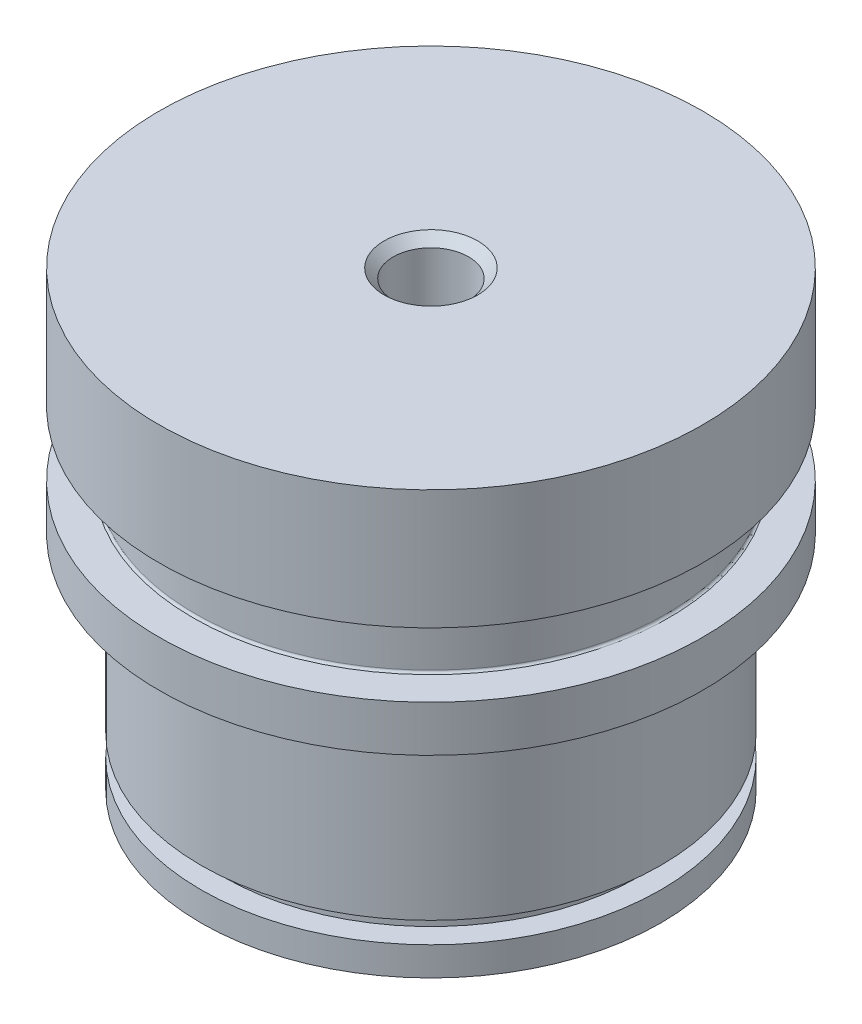
ISO-10303-21;
HEADER;
FILE_DESCRIPTION(('STEP AP214'),'2;1');
FILE_NAME('part.step','',(''),(''),'','','');
FILE_SCHEMA(('AUTOMOTIVE_DESIGN { 1 0 10303 214 1 1 1 1 }'));
ENDSEC;
DATA;
#1=APPLICATION_CONTEXT('core data for automotive mechanical design processes');
#2=APPLICATION_PROTOCOL_DEFINITION('international standard','automotive_design',2000,#1);
#3=PRODUCT_CONTEXT('',#1,'mechanical');
#4=PRODUCT('Part','Part','',(#3));
#5=PRODUCT_RELATED_PRODUCT_CATEGORY('part','',(#4));
#6=PRODUCT_DEFINITION_FORMATION('','',#4);
#7=PRODUCT_DEFINITION_CONTEXT('part definition',#1,'design');
#8=PRODUCT_DEFINITION('design','',#6,#7);
#9=PRODUCT_DEFINITION_SHAPE('','',#8);
#10=(LENGTH_UNIT() NAMED_UNIT(*) SI_UNIT(.MILLI.,.METRE.));
#11=(NAMED_UNIT(*) PLANE_ANGLE_UNIT() SI_UNIT($,.RADIAN.));
#12=(NAMED_UNIT(*) SI_UNIT($,.STERADIAN.) SOLID_ANGLE_UNIT());
#13=UNCERTAINTY_MEASURE_WITH_UNIT(LENGTH_MEASURE(1.E-05),#10,'distance_accuracy_value','');
#14=(GEOMETRIC_REPRESENTATION_CONTEXT(3) GLOBAL_UNCERTAINTY_ASSIGNED_CONTEXT((#13)) GLOBAL_UNIT_ASSIGNED_CONTEXT((#10,
#11,#12)) REPRESENTATION_CONTEXT('',''));
#15=CARTESIAN_POINT('',(0.,0.,0.));
#16=DIRECTION('',(0.,0.,1.));
#17=DIRECTION('',(1.,0.,0.));
#18=AXIS2_PLACEMENT_3D('',#15,#16,#17);
#19=CARTESIAN_POINT('',(-10.16,0.,0.));
#20=DIRECTION('',(0.,1.,0.));
#21=DIRECTION('',(0.,0.,1.));
#22=AXIS2_PLACEMENT_3D('',#19,#20,#21);
#23=PLANE('',#22);
#24=CARTESIAN_POINT('',(0.,0.,0.));
#25=DIRECTION('',(0.,1.,0.));
#26=DIRECTION('',(0.,0.,1.));
#27=AXIS2_PLACEMENT_3D('',#24,#25,#26);
#28=CIRCLE('',#27,10.6336634939895);
#29=CARTESIAN_POINT('',(0.,0.,10.6336634939895));
#30=VERTEX_POINT('',#29);
#31=EDGE_CURVE('E57',#30,#30,#28,.T.);
#32=ORIENTED_EDGE('',*,*,#31,.T.);
#33=EDGE_LOOP('',(#32));
#34=FACE_BOUND('',#33,.T.);
#35=CARTESIAN_POINT('',(0.,0.,0.));
#36=DIRECTION('',(0.,-1.,0.));
#37=DIRECTION('',(0.,0.,-1.));
#38=AXIS2_PLACEMENT_3D('',#35,#36,#37);
#39=CIRCLE('',#38,12.7);
#40=CARTESIAN_POINT('',(0.,0.,-12.7));
#41=VERTEX_POINT('',#40);
#42=EDGE_CURVE('E78',#41,#41,#39,.T.);
#43=ORIENTED_EDGE('',*,*,#42,.T.);
#44=EDGE_LOOP('',(#43));
#45=FACE_BOUND('',#44,.T.);
#46=ADVANCED_FACE('F36',(#34,#45),#23,.F.);
#47=CARTESIAN_POINT('',(0.,0.,0.));
#48=DIRECTION('',(0.,-1.,0.));
#49=DIRECTION('',(0.,0.,-1.));
#50=AXIS2_PLACEMENT_3D('',#47,#48,#49);
#51=CYLINDRICAL_SURFACE('',#50,12.7);
#52=ORIENTED_EDGE('',*,*,#42,.F.);
#53=EDGE_LOOP('',(#52));
#54=FACE_BOUND('',#53,.T.);
#55=CARTESIAN_POINT('',(0.,1.5875,0.));
#56=DIRECTION('',(0.,-1.,0.));
#57=DIRECTION('',(0.,0.,-1.));
#58=AXIS2_PLACEMENT_3D('',#55,#56,#57);
#59=CIRCLE('',#58,12.7);
#60=CARTESIAN_POINT('',(0.,1.5875,-12.7));
#61=VERTEX_POINT('',#60);
#62=EDGE_CURVE('E81',#61,#61,#59,.T.);
#63=ORIENTED_EDGE('',*,*,#62,.T.);
#64=EDGE_LOOP('',(#63));
#65=FACE_BOUND('',#64,.T.);
#66=ADVANCED_FACE('F191',(#54,#65),#51,.T.);
#67=CARTESIAN_POINT('',(-12.7,1.5875,0.));
#68=DIRECTION('',(0.,-1.,0.));
#69=DIRECTION('',(0.,0.,-1.));
#70=AXIS2_PLACEMENT_3D('',#67,#68,#69);
#71=PLANE('',#70);
#72=ORIENTED_EDGE('',*,*,#62,.F.);
#73=EDGE_LOOP('',(#72));
#74=FACE_BOUND('',#73,.T.);
#75=CARTESIAN_POINT('',(0.,1.5875,0.));
#76=DIRECTION('',(0.,-1.,0.));
#77=DIRECTION('',(0.,0.,-1.));
#78=AXIS2_PLACEMENT_3D('',#75,#76,#77);
#79=CIRCLE('',#78,11.4681);
#80=CARTESIAN_POINT('',(0.,1.5875,-11.4681));
#81=VERTEX_POINT('',#80);
#82=EDGE_CURVE('E84',#81,#81,#79,.T.);
#83=ORIENTED_EDGE('',*,*,#82,.T.);
#84=EDGE_LOOP('',(#83));
#85=FACE_BOUND('',#84,.T.);
#86=ADVANCED_FACE('F197',(#74,#85),#71,.F.);
#87=CARTESIAN_POINT('',(0.,0.,0.));
#88=DIRECTION('',(0.,-1.,0.));
#89=DIRECTION('',(0.,0.,-1.));
#90=AXIS2_PLACEMENT_3D('',#87,#88,#89);
#91=CYLINDRICAL_SURFACE('',#90,11.4681);
#92=ORIENTED_EDGE('',*,*,#82,.F.);
#93=EDGE_LOOP('',(#92));
#94=FACE_BOUND('',#93,.T.);
#95=CARTESIAN_POINT('',(0.,2.7559,0.));
#96=DIRECTION('',(0.,-1.,0.));
#97=DIRECTION('',(0.,0.,-1.));
#98=AXIS2_PLACEMENT_3D('',#95,#96,#97);
#99=CIRCLE('',#98,11.4681);
#100=CARTESIAN_POINT('',(0.,2.7559,-11.4681));
#101=VERTEX_POINT('',#100);
#102=EDGE_CURVE('E87',#101,#101,#99,.T.);
#103=ORIENTED_EDGE('',*,*,#102,.T.);
#104=EDGE_LOOP('',(#103));
#105=FACE_BOUND('',#104,.T.);
#106=ADVANCED_FACE('F276',(#94,#105),#91,.T.);
#107=CARTESIAN_POINT('',(-11.4681,2.7559,0.));
#108=DIRECTION('',(0.,1.,0.));
#109=DIRECTION('',(0.,0.,1.));
#110=AXIS2_PLACEMENT_3D('',#107,#108,#109);
#111=PLANE('',#110);
#112=ORIENTED_EDGE('',*,*,#102,.F.);
#113=EDGE_LOOP('',(#112));
#114=FACE_BOUND('',#113,.T.);
#115=CARTESIAN_POINT('',(0.,2.7559,0.));
#116=DIRECTION('',(0.,-1.,0.));
#117=DIRECTION('',(0.,0.,-1.));
#118=AXIS2_PLACEMENT_3D('',#115,#116,#117);
#119=CIRCLE('',#118,12.7);
#120=CARTESIAN_POINT('',(0.,2.7559,-12.7));
#121=VERTEX_POINT('',#120);
#122=EDGE_CURVE('E90',#121,#121,#119,.T.);
#123=ORIENTED_EDGE('',*,*,#122,.T.);
#124=EDGE_LOOP('',(#123));
#125=FACE_BOUND('',#124,.T.);
#126=ADVANCED_FACE('F272',(#114,#125),#111,.F.);
#127=CARTESIAN_POINT('',(0.,0.,0.));
#128=DIRECTION('',(0.,-1.,0.));
#129=DIRECTION('',(0.,0.,-1.));
#130=AXIS2_PLACEMENT_3D('',#127,#128,#129);
#131=CYLINDRICAL_SURFACE('',#130,12.7);
#132=ORIENTED_EDGE('',*,*,#122,.F.);
#133=EDGE_LOOP('',(#132));
#134=FACE_BOUND('',#133,.T.);
#135=CARTESIAN_POINT('',(0.,12.2809,0.));
#136=DIRECTION('',(0.,-1.,0.));
#137=DIRECTION('',(0.,0.,-1.));
#138=AXIS2_PLACEMENT_3D('',#135,#136,#137);
#139=CIRCLE('',#138,12.7);
#140=CARTESIAN_POINT('',(0.,12.2809,-12.7));
#141=VERTEX_POINT('',#140);
#142=EDGE_CURVE('E93',#141,#141,#139,.T.);
#143=ORIENTED_EDGE('',*,*,#142,.T.);
#144=EDGE_LOOP('',(#143));
#145=FACE_BOUND('',#144,.T.);
#146=ADVANCED_FACE('F268',(#134,#145),#131,.T.);
#147=CARTESIAN_POINT('',(-12.7,12.2809,0.));
#148=DIRECTION('',(0.,1.,0.));
#149=DIRECTION('',(0.,0.,1.));
#150=AXIS2_PLACEMENT_3D('',#147,#148,#149);
#151=PLANE('',#150);
#152=ORIENTED_EDGE('',*,*,#142,.F.);
#153=EDGE_LOOP('',(#152));
#154=FACE_BOUND('',#153,.T.);
#155=CARTESIAN_POINT('',(0.,12.2809,0.));
#156=DIRECTION('',(0.,-1.,0.));
#157=DIRECTION('',(0.,0.,-1.));
#158=AXIS2_PLACEMENT_3D('',#155,#156,#157);
#159=CIRCLE('',#158,15.0114);
#160=CARTESIAN_POINT('',(0.,12.2809,-15.0114));
#161=VERTEX_POINT('',#160);
#162=EDGE_CURVE('E96',#161,#161,#159,.T.);
#163=ORIENTED_EDGE('',*,*,#162,.T.);
#164=EDGE_LOOP('',(#163));
#165=FACE_BOUND('',#164,.T.);
#166=ADVANCED_FACE('F264',(#154,#165),#151,.F.);
#167=CARTESIAN_POINT('',(0.,0.,0.));
#168=DIRECTION('',(0.,-1.,0.));
#169=DIRECTION('',(0.,0.,-1.));
#170=AXIS2_PLACEMENT_3D('',#167,#168,#169);
#171=CYLINDRICAL_SURFACE('',#170,15.0114);
#172=ORIENTED_EDGE('',*,*,#162,.F.);
#173=EDGE_LOOP('',(#172));
#174=FACE_BOUND('',#173,.T.);
#175=CARTESIAN_POINT('',(0.,14.8209,0.));
#176=DIRECTION('',(0.,-1.,0.));
#177=DIRECTION('',(0.,0.,-1.));
#178=AXIS2_PLACEMENT_3D('',#175,#176,#177);
#179=CIRCLE('',#178,15.0114);
#180=CARTESIAN_POINT('',(0.,14.8209,-15.0114));
#181=VERTEX_POINT('',#180);
#182=EDGE_CURVE('E99',#181,#181,#179,.T.);
#183=ORIENTED_EDGE('',*,*,#182,.T.);
#184=EDGE_LOOP('',(#183));
#185=FACE_BOUND('',#184,.T.);
#186=ADVANCED_FACE('F260',(#174,#185),#171,.T.);
#187=CARTESIAN_POINT('',(-15.0114,14.8209,0.));
#188=DIRECTION('',(0.,-1.,0.));
#189=DIRECTION('',(0.,0.,-1.));
#190=AXIS2_PLACEMENT_3D('',#187,#188,#189);
#191=PLANE('',#190);
#192=CARTESIAN_POINT('',(0.,14.8209,0.));
#193=DIRECTION('',(0.,-1.,0.));
#194=DIRECTION('',(0.,0.,-1.));
#195=AXIS2_PLACEMENT_3D('',#192,#193,#194);
#196=CIRCLE('',#195,13.1445);
#197=CARTESIAN_POINT('',(0.,14.8209,-13.1445));
#198=VERTEX_POINT('',#197);
#199=EDGE_CURVE('E75',#198,#198,#196,.T.);
#200=ORIENTED_EDGE('',*,*,#199,.T.);
#201=EDGE_LOOP('',(#200));
#202=FACE_BOUND('',#201,.T.);
#203=ORIENTED_EDGE('',*,*,#182,.F.);
#204=EDGE_LOOP('',(#203));
#205=FACE_BOUND('',#204,.T.);
#206=ADVANCED_FACE('F256',(#202,#205),#191,.F.);
#207=CARTESIAN_POINT('',(0.,0.,0.));
#208=DIRECTION('',(0.,-1.,0.));
#209=DIRECTION('',(0.,0.,-1.));
#210=AXIS2_PLACEMENT_3D('',#207,#208,#209);
#211=CYLINDRICAL_SURFACE('',#210,13.0175);
#212=CARTESIAN_POINT('',(0.,14.9479,0.));
#213=DIRECTION('',(0.,-1.,0.));
#214=DIRECTION('',(0.,0.,-1.));
#215=AXIS2_PLACEMENT_3D('',#212,#213,#214);
#216=CIRCLE('',#215,13.0175);
#217=CARTESIAN_POINT('',(0.,14.9479,-13.0175));
#218=VERTEX_POINT('',#217);
#219=EDGE_CURVE('E69',#218,#218,#216,.F.);
#220=ORIENTED_EDGE('',*,*,#219,.T.);
#221=EDGE_LOOP('',(#220));
#222=FACE_BOUND('',#221,.T.);
#223=CARTESIAN_POINT('',(0.,18.2499,0.));
#224=DIRECTION('',(0.,1.,0.));
#225=DIRECTION('',(0.,0.,1.));
#226=AXIS2_PLACEMENT_3D('',#223,#224,#225);
#227=CIRCLE('',#226,13.0175);
#228=CARTESIAN_POINT('',(0.,18.2499,13.0175));
#229=VERTEX_POINT('',#228);
#230=EDGE_CURVE('E72',#229,#229,#227,.F.);
#231=ORIENTED_EDGE('',*,*,#230,.T.);
#232=EDGE_LOOP('',(#231));
#233=FACE_BOUND('',#232,.T.);
#234=ADVANCED_FACE('F252',(#222,#233),#211,.T.);
#235=CARTESIAN_POINT('',(-13.0175,18.3769,0.));
#236=DIRECTION('',(0.,1.,0.));
#237=DIRECTION('',(0.,0.,1.));
#238=AXIS2_PLACEMENT_3D('',#235,#236,#237);
#239=PLANE('',#238);
#240=CARTESIAN_POINT('',(0.,18.3769,0.));
#241=DIRECTION('',(0.,1.,0.));
#242=DIRECTION('',(0.,0.,1.));
#243=AXIS2_PLACEMENT_3D('',#240,#241,#242);
#244=CIRCLE('',#243,13.1445);
#245=CARTESIAN_POINT('',(0.,18.3769,13.1445));
#246=VERTEX_POINT('',#245);
#247=EDGE_CURVE('E66',#246,#246,#244,.T.);
#248=ORIENTED_EDGE('',*,*,#247,.T.);
#249=EDGE_LOOP('',(#248));
#250=FACE_BOUND('',#249,.T.);
#251=CARTESIAN_POINT('',(0.,18.3769,0.));
#252=DIRECTION('',(0.,-1.,0.));
#253=DIRECTION('',(0.,0.,-1.));
#254=AXIS2_PLACEMENT_3D('',#251,#252,#253);
#255=CIRCLE('',#254,15.0114);
#256=CARTESIAN_POINT('',(0.,18.3769,-15.0114));
#257=VERTEX_POINT('',#256);
#258=EDGE_CURVE('E102',#257,#257,#255,.T.);
#259=ORIENTED_EDGE('',*,*,#258,.T.);
#260=EDGE_LOOP('',(#259));
#261=FACE_BOUND('',#260,.T.);
#262=ADVANCED_FACE('F248',(#250,#261),#239,.F.);
#263=CARTESIAN_POINT('',(0.,0.,0.));
#264=DIRECTION('',(0.,-1.,0.));
#265=DIRECTION('',(0.,0.,-1.));
#266=AXIS2_PLACEMENT_3D('',#263,#264,#265);
#267=CYLINDRICAL_SURFACE('',#266,15.0114);
#268=ORIENTED_EDGE('',*,*,#258,.F.);
#269=EDGE_LOOP('',(#268));
#270=FACE_BOUND('',#269,.T.);
#271=CARTESIAN_POINT('',(0.,24.9809,0.));
#272=DIRECTION('',(0.,-1.,0.));
#273=DIRECTION('',(0.,0.,-1.));
#274=AXIS2_PLACEMENT_3D('',#271,#272,#273);
#275=CIRCLE('',#274,15.0114);
#276=CARTESIAN_POINT('',(0.,24.9809,-15.0114));
#277=VERTEX_POINT('',#276);
#278=EDGE_CURVE('E105',#277,#277,#275,.T.);
#279=ORIENTED_EDGE('',*,*,#278,.T.);
#280=EDGE_LOOP('',(#279));
#281=FACE_BOUND('',#280,.T.);
#282=ADVANCED_FACE('F245',(#270,#281),#267,.T.);
#283=CARTESIAN_POINT('',(-10.16,24.9809,0.));
#284=DIRECTION('',(0.,-1.,0.));
#285=DIRECTION('',(0.,0.,-1.));
#286=AXIS2_PLACEMENT_3D('',#283,#284,#285);
#287=PLANE('',#286);
#288=CARTESIAN_POINT('',(0.,24.9809,0.));
#289=DIRECTION('',(0.,-1.,0.));
#290=DIRECTION('',(0.,0.,-1.));
#291=AXIS2_PLACEMENT_3D('',#288,#289,#290);
#292=CIRCLE('',#291,2.58866418966269);
#293=CARTESIAN_POINT('',(0.,24.9809,-2.58866418966269));
#294=VERTEX_POINT('',#293);
#295=EDGE_CURVE('E44',#294,#294,#292,.T.);
#296=ORIENTED_EDGE('',*,*,#295,.T.);
#297=EDGE_LOOP('',(#296));
#298=FACE_BOUND('',#297,.T.);
#299=ORIENTED_EDGE('',*,*,#278,.F.);
#300=EDGE_LOOP('',(#299));
#301=FACE_BOUND('',#300,.T.);
#302=ADVANCED_FACE('F207',(#298,#301),#287,.F.);
#303=CARTESIAN_POINT('',(0.,14.9479,0.));
#304=DIRECTION('',(0.,-1.,0.));
#305=DIRECTION('',(0.,0.,-1.));
#306=AXIS2_PLACEMENT_3D('',#303,#304,#305);
#307=TOROIDAL_SURFACE('',#306,13.1445,0.127);
#308=ORIENTED_EDGE('',*,*,#219,.F.);
#309=EDGE_LOOP('',(#308));
#310=FACE_BOUND('',#309,.T.);
#311=ORIENTED_EDGE('',*,*,#199,.F.);
#312=EDGE_LOOP('',(#311));
#313=FACE_BOUND('',#312,.T.);
#314=ADVANCED_FACE('F203',(#310,#313),#307,.F.);
#315=CARTESIAN_POINT('',(0.,18.2499,0.));
#316=DIRECTION('',(0.,1.,0.));
#317=DIRECTION('',(0.,0.,1.));
#318=AXIS2_PLACEMENT_3D('',#315,#316,#317);
#319=TOROIDAL_SURFACE('',#318,13.1445,0.127);
#320=ORIENTED_EDGE('',*,*,#247,.F.);
#321=EDGE_LOOP('',(#320));
#322=FACE_BOUND('',#321,.T.);
#323=ORIENTED_EDGE('',*,*,#230,.F.);
#324=EDGE_LOOP('',(#323));
#325=FACE_BOUND('',#324,.T.);
#326=ADVANCED_FACE('F206',(#322,#325),#319,.F.);
#327=CARTESIAN_POINT('',(0.,0.,0.));
#328=DIRECTION('',(0.,-1.,0.));
#329=DIRECTION('',(0.,0.,-1.));
#330=AXIS2_PLACEMENT_3D('',#327,#328,#329);
#331=CONICAL_SURFACE('',#330,10.25,0.261799387799152);
#332=CARTESIAN_POINT('',(0.,2.54566130496976,0.));
#333=DIRECTION('',(0.,1.,0.));
#334=DIRECTION('',(0.,0.,1.));
#335=AXIS2_PLACEMENT_3D('',#332,#333,#334);
#336=CIRCLE('',#335,9.56789210913019);
#337=CARTESIAN_POINT('',(0.,2.54566130496976,9.56789210913019));
#338=VERTEX_POINT('',#337);
#339=EDGE_CURVE('E48',#338,#338,#336,.T.);
#340=ORIENTED_EDGE('',*,*,#339,.T.);
#341=EDGE_LOOP('',(#340));
#342=FACE_BOUND('',#341,.T.);
#343=CARTESIAN_POINT('',(0.,0.370590477448737,0.));
#344=DIRECTION('',(0.,1.,0.));
#345=DIRECTION('',(0.,0.,1.));
#346=AXIS2_PLACEMENT_3D('',#343,#344,#345);
#347=CIRCLE('',#346,10.1507005808449);
#348=CARTESIAN_POINT('',(0.,0.370590477448737,10.1507005808449));
#349=VERTEX_POINT('',#348);
#350=EDGE_CURVE('E60',#349,#349,#347,.F.);
#351=ORIENTED_EDGE('',*,*,#350,.T.);
#352=EDGE_LOOP('',(#351));
#353=FACE_BOUND('',#352,.T.);
#354=ADVANCED_FACE('F211',(#342,#353),#331,.F.);
#355=CARTESIAN_POINT('',(0.,0.,0.));
#356=DIRECTION('',(0.,-1.,0.));
#357=DIRECTION('',(0.,0.,-1.));
#358=AXIS2_PLACEMENT_3D('',#355,#356,#357);
#359=CYLINDRICAL_SURFACE('',#358,9.49974376170833);
#360=CARTESIAN_POINT('',(0.,3.0632993951748,0.));
#361=DIRECTION('',(0.,1.,0.));
#362=DIRECTION('',(0.,0.,1.));
#363=AXIS2_PLACEMENT_3D('',#360,#361,#362);
#364=CIRCLE('',#363,9.49974376170833);
#365=CARTESIAN_POINT('',(0.,3.0632993951748,9.49974376170833));
#366=VERTEX_POINT('',#365);
#367=EDGE_CURVE('E52',#366,#366,#364,.F.);
#368=ORIENTED_EDGE('',*,*,#367,.T.);
#369=EDGE_LOOP('',(#368));
#370=FACE_BOUND('',#369,.T.);
#371=CARTESIAN_POINT('',(0.,4.0699944,0.));
#372=DIRECTION('',(0.,-1.,0.));
#373=DIRECTION('',(0.,0.,-1.));
#374=AXIS2_PLACEMENT_3D('',#371,#372,#373);
#375=CIRCLE('',#374,9.49974376170833);
#376=CARTESIAN_POINT('',(0.,4.0699944,-9.49974376170833));
#377=VERTEX_POINT('',#376);
#378=EDGE_CURVE('E108',#377,#377,#375,.T.);
#379=ORIENTED_EDGE('',*,*,#378,.F.);
#380=EDGE_LOOP('',(#379));
#381=FACE_BOUND('',#380,.T.);
#382=ADVANCED_FACE('F227',(#370,#381),#359,.F.);
#383=CARTESIAN_POINT('',(9.49974376170833,4.0699944,0.));
#384=DIRECTION('',(0.,-1.,0.));
#385=DIRECTION('',(0.,0.,-1.));
#386=AXIS2_PLACEMENT_3D('',#383,#384,#385);
#387=PLANE('',#386);
#388=CARTESIAN_POINT('',(0.,4.0699944,0.));
#389=DIRECTION('',(0.,-1.,0.));
#390=DIRECTION('',(0.,0.,-1.));
#391=AXIS2_PLACEMENT_3D('',#388,#389,#390);
#392=CIRCLE('',#391,10.);
#393=CARTESIAN_POINT('',(0.,4.0699944,-10.));
#394=VERTEX_POINT('',#393);
#395=EDGE_CURVE('E111',#394,#394,#392,.T.);
#396=ORIENTED_EDGE('',*,*,#395,.F.);
#397=EDGE_LOOP('',(#396));
#398=FACE_BOUND('',#397,.T.);
#399=ORIENTED_EDGE('',*,*,#378,.T.);
#400=EDGE_LOOP('',(#399));
#401=FACE_BOUND('',#400,.T.);
#402=ADVANCED_FACE('F187',(#398,#401),#387,.F.);
#403=CARTESIAN_POINT('',(0.,0.,0.));
#404=DIRECTION('',(0.,-1.,0.));
#405=DIRECTION('',(0.,0.,-1.));
#406=AXIS2_PLACEMENT_3D('',#403,#404,#405);
#407=CYLINDRICAL_SURFACE('',#406,10.);
#408=CARTESIAN_POINT('',(0.,5.1699944,0.));
#409=DIRECTION('',(0.,-1.,0.));
#410=DIRECTION('',(0.,0.,-1.));
#411=AXIS2_PLACEMENT_3D('',#408,#409,#410);
#412=CIRCLE('',#411,10.);
#413=CARTESIAN_POINT('',(0.,5.1699944,-10.));
#414=VERTEX_POINT('',#413);
#415=EDGE_CURVE('E114',#414,#414,#412,.T.);
#416=ORIENTED_EDGE('',*,*,#415,.F.);
#417=EDGE_LOOP('',(#416));
#418=FACE_BOUND('',#417,.T.);
#419=ORIENTED_EDGE('',*,*,#395,.T.);
#420=EDGE_LOOP('',(#419));
#421=FACE_BOUND('',#420,.T.);
#422=ADVANCED_FACE('F181',(#418,#421),#407,.F.);
#423=CARTESIAN_POINT('',(0.,0.,0.));
#424=DIRECTION('',(0.,-1.,0.));
#425=DIRECTION('',(0.,0.,-1.));
#426=AXIS2_PLACEMENT_3D('',#423,#424,#425);
#427=CYLINDRICAL_SURFACE('',#426,9.525);
#428=CARTESIAN_POINT('',(0.,5.66936900888595,0.));
#429=DIRECTION('',(0.,-1.,0.));
#430=DIRECTION('',(0.,0.,-1.));
#431=AXIS2_PLACEMENT_3D('',#428,#429,#430);
#432=CIRCLE('',#431,9.525);
#433=CARTESIAN_POINT('',(0.,5.66936900888595,-9.525));
#434=VERTEX_POINT('',#433);
#435=EDGE_CURVE('E63',#434,#434,#432,.T.);
#436=ORIENTED_EDGE('',*,*,#435,.T.);
#437=EDGE_LOOP('',(#436));
#438=FACE_BOUND('',#437,.T.);
#439=CARTESIAN_POINT('',(0.,10.5039944,0.));
#440=DIRECTION('',(0.,-1.,0.));
#441=DIRECTION('',(0.,0.,-1.));
#442=AXIS2_PLACEMENT_3D('',#439,#440,#441);
#443=CIRCLE('',#442,9.525);
#444=CARTESIAN_POINT('',(0.,10.5039944,-9.525));
#445=VERTEX_POINT('',#444);
#446=EDGE_CURVE('E117',#445,#445,#443,.T.);
#447=ORIENTED_EDGE('',*,*,#446,.F.);
#448=EDGE_LOOP('',(#447));
#449=FACE_BOUND('',#448,.T.);
#450=ADVANCED_FACE('F176',(#438,#449),#427,.F.);
#451=CARTESIAN_POINT('',(9.525,10.5039944,0.));
#452=DIRECTION('',(0.,1.,0.));
#453=DIRECTION('',(0.,0.,1.));
#454=AXIS2_PLACEMENT_3D('',#451,#452,#453);
#455=PLANE('',#454);
#456=CARTESIAN_POINT('',(0.,10.5039944,0.));
#457=DIRECTION('',(0.,-1.,0.));
#458=DIRECTION('',(0.,0.,-1.));
#459=AXIS2_PLACEMENT_3D('',#456,#457,#458);
#460=CIRCLE('',#459,0.508000000000005);
#461=CARTESIAN_POINT('',(0.,10.5039944,-0.508000000000005));
#462=VERTEX_POINT('',#461);
#463=EDGE_CURVE('E120',#462,#462,#460,.T.);
#464=ORIENTED_EDGE('',*,*,#463,.F.);
#465=EDGE_LOOP('',(#464));
#466=FACE_BOUND('',#465,.T.);
#467=ORIENTED_EDGE('',*,*,#446,.T.);
#468=EDGE_LOOP('',(#467));
#469=FACE_BOUND('',#468,.T.);
#470=ADVANCED_FACE('F172',(#466,#469),#455,.F.);
#471=CARTESIAN_POINT('',(0.,5.66936900888595,0.));
#472=DIRECTION('',(0.,-1.,0.));
#473=DIRECTION('',(0.,0.,-1.));
#474=AXIS2_PLACEMENT_3D('',#471,#472,#473);
#475=TOROIDAL_SURFACE('',#474,10.025,0.5);
#476=ORIENTED_EDGE('',*,*,#415,.T.);
#477=EDGE_LOOP('',(#476));
#478=FACE_BOUND('',#477,.T.);
#479=ORIENTED_EDGE('',*,*,#435,.F.);
#480=EDGE_LOOP('',(#479));
#481=FACE_BOUND('',#480,.T.);
#482=ADVANCED_FACE('F175',(#478,#481),#475,.T.);
#483=CARTESIAN_POINT('',(0.,0.5,0.));
#484=DIRECTION('',(0.,1.,0.));
#485=DIRECTION('',(0.,0.,1.));
#486=AXIS2_PLACEMENT_3D('',#483,#484,#485);
#487=TOROIDAL_SURFACE('',#486,10.6336634939895,0.5);
#488=ORIENTED_EDGE('',*,*,#31,.F.);
#489=EDGE_LOOP('',(#488));
#490=FACE_BOUND('',#489,.T.);
#491=ORIENTED_EDGE('',*,*,#350,.F.);
#492=EDGE_LOOP('',(#491));
#493=FACE_BOUND('',#492,.T.);
#494=ADVANCED_FACE('F215',(#490,#493),#487,.T.);
#495=CARTESIAN_POINT('',(0.,3.0632993951748,0.));
#496=DIRECTION('',(0.,1.,0.));
#497=DIRECTION('',(0.,0.,1.));
#498=AXIS2_PLACEMENT_3D('',#495,#496,#497);
#499=TOROIDAL_SURFACE('',#498,11.4997437617083,2.);
#500=ORIENTED_EDGE('',*,*,#339,.F.);
#501=EDGE_LOOP('',(#500));
#502=FACE_BOUND('',#501,.T.);
#503=ORIENTED_EDGE('',*,*,#367,.F.);
#504=EDGE_LOOP('',(#503));
#505=FACE_BOUND('',#504,.T.);
#506=ADVANCED_FACE('F168',(#502,#505),#499,.T.);
#507=CARTESIAN_POINT('',(0.,0.,0.));
#508=DIRECTION('',(0.,-1.,0.));
#509=DIRECTION('',(0.,0.,-1.));
#510=AXIS2_PLACEMENT_3D('',#507,#508,#509);
#511=CYLINDRICAL_SURFACE('',#510,0.508000000000006);
#512=CARTESIAN_POINT('',(0.,14.5669,0.));
#513=DIRECTION('',(0.,-1.,0.));
#514=DIRECTION('',(0.,0.,-1.));
#515=AXIS2_PLACEMENT_3D('',#512,#513,#514);
#516=CIRCLE('',#515,0.508000000000006);
#517=CARTESIAN_POINT('',(0.,14.5669,-0.508000000000006));
#518=VERTEX_POINT('',#517);
#519=EDGE_CURVE('E123',#518,#518,#516,.T.);
#520=ORIENTED_EDGE('',*,*,#519,.F.);
#521=EDGE_LOOP('',(#520));
#522=FACE_BOUND('',#521,.T.);
#523=ORIENTED_EDGE('',*,*,#463,.T.);
#524=EDGE_LOOP('',(#523));
#525=FACE_BOUND('',#524,.T.);
#526=ADVANCED_FACE('F162',(#522,#525),#511,.F.);
#527=CARTESIAN_POINT('',(0.850900000000002,14.5669,0.));
#528=DIRECTION('',(0.,-1.,0.));
#529=DIRECTION('',(0.,0.,-1.));
#530=AXIS2_PLACEMENT_3D('',#527,#528,#529);
#531=PLANE('',#530);
#532=CARTESIAN_POINT('',(0.,14.5669,0.));
#533=DIRECTION('',(0.,-1.,0.));
#534=DIRECTION('',(0.,0.,-1.));
#535=AXIS2_PLACEMENT_3D('',#532,#533,#534);
#536=CIRCLE('',#535,0.850900000000002);
#537=CARTESIAN_POINT('',(0.,14.5669,-0.850900000000002));
#538=VERTEX_POINT('',#537);
#539=EDGE_CURVE('E126',#538,#538,#536,.T.);
#540=ORIENTED_EDGE('',*,*,#539,.F.);
#541=EDGE_LOOP('',(#540));
#542=FACE_BOUND('',#541,.T.);
#543=ORIENTED_EDGE('',*,*,#519,.T.);
#544=EDGE_LOOP('',(#543));
#545=FACE_BOUND('',#544,.T.);
#546=ADVANCED_FACE('F156',(#542,#545),#531,.F.);
#547=CARTESIAN_POINT('',(0.,0.,0.));
#548=DIRECTION('',(0.,-1.,0.));
#549=DIRECTION('',(0.,0.,-1.));
#550=AXIS2_PLACEMENT_3D('',#547,#548,#549);
#551=CYLINDRICAL_SURFACE('',#550,0.850900000000003);
#552=CARTESIAN_POINT('',(0.,16.3343231591813,0.));
#553=DIRECTION('',(0.,-1.,0.));
#554=DIRECTION('',(0.,0.,-1.));
#555=AXIS2_PLACEMENT_3D('',#552,#553,#554);
#556=CIRCLE('',#555,0.850900000000003);
#557=CARTESIAN_POINT('',(0.,16.3343231591813,-0.850900000000003));
#558=VERTEX_POINT('',#557);
#559=EDGE_CURVE('E129',#558,#558,#556,.T.);
#560=ORIENTED_EDGE('',*,*,#559,.F.);
#561=EDGE_LOOP('',(#560));
#562=FACE_BOUND('',#561,.T.);
#563=ORIENTED_EDGE('',*,*,#539,.T.);
#564=EDGE_LOOP('',(#563));
#565=FACE_BOUND('',#564,.T.);
#566=ADVANCED_FACE('F150',(#562,#565),#551,.F.);
#567=CARTESIAN_POINT('',(0.,16.3343231591813,0.));
#568=DIRECTION('',(0.,1.,0.));
#569=DIRECTION('',(0.,0.,1.));
#570=AXIS2_PLACEMENT_3D('',#567,#568,#569);
#571=CONICAL_SURFACE('',#570,0.850900000000003,0.349065850398858);
#572=CARTESIAN_POINT('',(0.,18.3930079895787,0.));
#573=DIRECTION('',(0.,-1.,0.));
#574=DIRECTION('',(0.,0.,-1.));
#575=AXIS2_PLACEMENT_3D('',#572,#573,#574);
#576=CIRCLE('',#575,1.6002);
#577=CARTESIAN_POINT('',(0.,18.3930079895787,-1.6002));
#578=VERTEX_POINT('',#577);
#579=EDGE_CURVE('E132',#578,#578,#576,.T.);
#580=ORIENTED_EDGE('',*,*,#579,.F.);
#581=EDGE_LOOP('',(#580));
#582=FACE_BOUND('',#581,.T.);
#583=ORIENTED_EDGE('',*,*,#559,.T.);
#584=EDGE_LOOP('',(#583));
#585=FACE_BOUND('',#584,.T.);
#586=ADVANCED_FACE('F144',(#582,#585),#571,.F.);
#587=CARTESIAN_POINT('',(0.,18.3930079895787,0.));
#588=DIRECTION('',(0.,1.,0.));
#589=DIRECTION('',(0.,0.,1.));
#590=AXIS2_PLACEMENT_3D('',#587,#588,#589);
#591=CONICAL_SURFACE('',#590,1.6002,1.02974425867665);
#592=CARTESIAN_POINT('',(0.,18.6817,0.));
#593=DIRECTION('',(0.,-1.,0.));
#594=DIRECTION('',(0.,0.,-1.));
#595=AXIS2_PLACEMENT_3D('',#592,#593,#594);
#596=CIRCLE('',#595,2.0806641896627);
#597=CARTESIAN_POINT('',(0.,18.6817,-2.0806641896627));
#598=VERTEX_POINT('',#597);
#599=EDGE_CURVE('E135',#598,#598,#596,.T.);
#600=ORIENTED_EDGE('',*,*,#599,.F.);
#601=EDGE_LOOP('',(#600));
#602=FACE_BOUND('',#601,.T.);
#603=ORIENTED_EDGE('',*,*,#579,.T.);
#604=EDGE_LOOP('',(#603));
#605=FACE_BOUND('',#604,.T.);
#606=ADVANCED_FACE('F141',(#602,#605),#591,.F.);
#607=CARTESIAN_POINT('',(0.,0.,0.));
#608=DIRECTION('',(0.,-1.,0.));
#609=DIRECTION('',(0.,0.,-1.));
#610=AXIS2_PLACEMENT_3D('',#607,#608,#609);
#611=CYLINDRICAL_SURFACE('',#610,2.0806641896627);
#612=CARTESIAN_POINT('',(0.,24.4729,0.));
#613=DIRECTION('',(0.,-1.,0.));
#614=DIRECTION('',(0.,0.,-1.));
#615=AXIS2_PLACEMENT_3D('',#612,#613,#614);
#616=CIRCLE('',#615,2.0806641896627);
#617=CARTESIAN_POINT('',(0.,24.4729,-2.0806641896627));
#618=VERTEX_POINT('',#617);
#619=EDGE_CURVE('E10',#618,#618,#616,.F.);
#620=ORIENTED_EDGE('',*,*,#619,.T.);
#621=EDGE_LOOP('',(#620));
#622=FACE_BOUND('',#621,.T.);
#623=ORIENTED_EDGE('',*,*,#599,.T.);
#624=EDGE_LOOP('',(#623));
#625=FACE_BOUND('',#624,.T.);
#626=ADVANCED_FACE('F139',(#622,#625),#611,.F.);
#627=CARTESIAN_POINT('',(0.,24.9809,0.));
#628=DIRECTION('',(0.,1.,0.));
#629=DIRECTION('',(0.,0.,1.));
#630=AXIS2_PLACEMENT_3D('',#627,#628,#629);
#631=CONICAL_SURFACE('',#630,2.58866418966269,0.785398163397442);
#632=ORIENTED_EDGE('',*,*,#619,.F.);
#633=EDGE_LOOP('',(#632));
#634=FACE_BOUND('',#633,.T.);
#635=ORIENTED_EDGE('',*,*,#295,.F.);
#636=EDGE_LOOP('',(#635));
#637=FACE_BOUND('',#636,.T.);
#638=ADVANCED_FACE('F39',(#634,#637),#631,.F.);
#639=CLOSED_SHELL('',(#46,#66,#86,#106,#126,#146,#166,#186,#206,#234,#262,#282,#302,#314,#326,
#354,#382,#402,#422,#450,#470,#482,#494,#506,#526,#546,#566,#586,#606,#626,#638));
#640=MANIFOLD_SOLID_BREP('B2',#639);
#641=ADVANCED_BREP_SHAPE_REPRESENTATION('',(#18,#640),#14);
#642=SHAPE_DEFINITION_REPRESENTATION(#9,#641);
ENDSEC;
END-ISO-10303-21;
